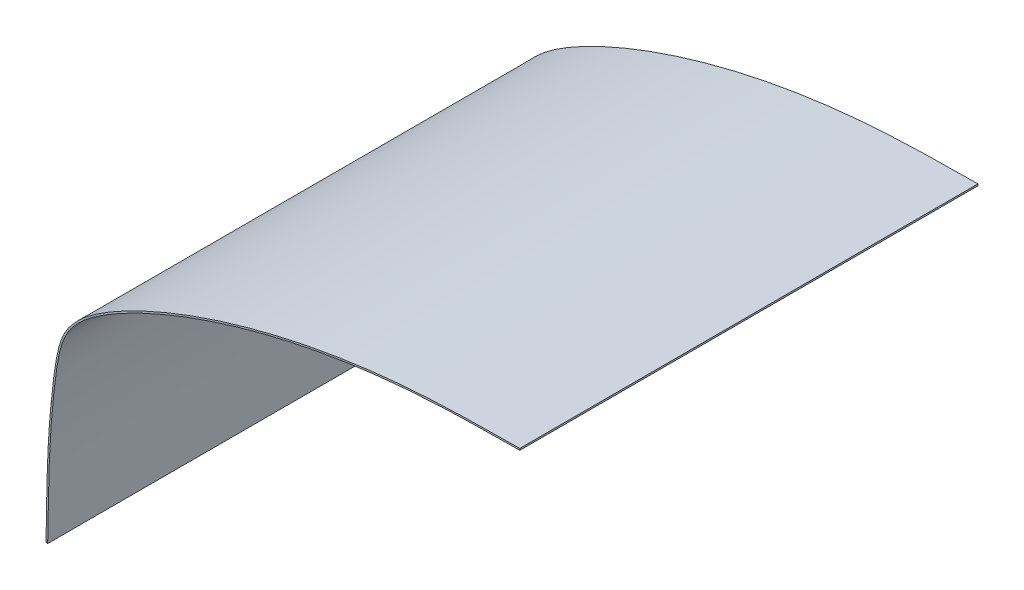
ISO-10303-21;
HEADER;
FILE_DESCRIPTION(('STEP AP214'),'2;1');
FILE_NAME('part.step','',(''),(''),'','','');
FILE_SCHEMA(('AUTOMOTIVE_DESIGN { 1 0 10303 214 1 1 1 1 }'));
ENDSEC;
DATA;
#1=APPLICATION_CONTEXT('core data for automotive mechanical design processes');
#2=APPLICATION_PROTOCOL_DEFINITION('international standard','automotive_design',2000,#1);
#3=PRODUCT_CONTEXT('',#1,'mechanical');
#4=PRODUCT('Part','Part','',(#3));
#5=PRODUCT_RELATED_PRODUCT_CATEGORY('part','',(#4));
#6=PRODUCT_DEFINITION_FORMATION('','',#4);
#7=PRODUCT_DEFINITION_CONTEXT('part definition',#1,'design');
#8=PRODUCT_DEFINITION('design','',#6,#7);
#9=PRODUCT_DEFINITION_SHAPE('','',#8);
#10=(LENGTH_UNIT() NAMED_UNIT(*) SI_UNIT(.MILLI.,.METRE.));
#11=(NAMED_UNIT(*) PLANE_ANGLE_UNIT() SI_UNIT($,.RADIAN.));
#12=(NAMED_UNIT(*) SI_UNIT($,.STERADIAN.) SOLID_ANGLE_UNIT());
#13=UNCERTAINTY_MEASURE_WITH_UNIT(LENGTH_MEASURE(1.E-05),#10,'distance_accuracy_value','');
#14=(GEOMETRIC_REPRESENTATION_CONTEXT(3) GLOBAL_UNCERTAINTY_ASSIGNED_CONTEXT((#13)) GLOBAL_UNIT_ASSIGNED_CONTEXT((#10,
#11,#12)) REPRESENTATION_CONTEXT('',''));
#15=CARTESIAN_POINT('',(0.,0.,0.));
#16=DIRECTION('',(0.,0.,1.));
#17=DIRECTION('',(1.,0.,0.));
#18=AXIS2_PLACEMENT_3D('',#15,#16,#17);
#19=CARTESIAN_POINT('',(-954.562567684704,-367.060526194167,820.));
#20=CARTESIAN_POINT('',(-949.731580753523,-240.772303614039,820.));
#21=CARTESIAN_POINT('',(-965.897306625211,-60.6768027234358,820.));
#22=CARTESIAN_POINT('',(-899.861496721399,-44.1678502474826,820.));
#23=CARTESIAN_POINT('',(-938.084782602638,-2.00052486851282,820.));
#24=CARTESIAN_POINT('',(-973.67710425698,-35.9596243008455,820.));
#25=CARTESIAN_POINT('',(-868.494487017088,61.4894455986176,820.));
#26=CARTESIAN_POINT('',(-756.654782625281,120.575073505418,820.));
#27=CARTESIAN_POINT('',(-600.913737595076,149.988916038669,820.));
#28=CARTESIAN_POINT('',(-454.833796863585,205.450958104821,820.));
#29=CARTESIAN_POINT('',(-262.325865110254,197.223411300237,820.));
#30=CARTESIAN_POINT('',(-109.562567684704,199.939473805833,820.));
#31=B_SPLINE_CURVE_WITH_KNOTS('',11,(#19,#20,#21,#22,#23,#24,#25,#26,#27,#28,#29,#30),
.UNSPECIFIED.,.F.,.F.,(12,12),(0.,1.),.UNSPECIFIED.);
#32=DIRECTION('',(0.,0.,-1.));
#33=VECTOR('',#32,1.);
#34=SURFACE_OF_LINEAR_EXTRUSION('',#31,#33);
#35=CARTESIAN_POINT('',(-954.562567684704,-367.060526194167,0.));
#36=CARTESIAN_POINT('',(-949.731580753523,-240.772303614039,0.));
#37=CARTESIAN_POINT('',(-965.897306625211,-60.6768027234358,0.));
#38=CARTESIAN_POINT('',(-899.861496721399,-44.1678502474826,0.));
#39=CARTESIAN_POINT('',(-938.084782602638,-2.00052486851282,0.));
#40=CARTESIAN_POINT('',(-973.67710425698,-35.9596243008455,0.));
#41=CARTESIAN_POINT('',(-868.494487017088,61.4894455986176,0.));
#42=CARTESIAN_POINT('',(-756.654782625281,120.575073505418,0.));
#43=CARTESIAN_POINT('',(-600.913737595076,149.988916038669,0.));
#44=CARTESIAN_POINT('',(-454.833796863585,205.450958104821,0.));
#45=CARTESIAN_POINT('',(-262.325865110254,197.223411300237,0.));
#46=CARTESIAN_POINT('',(-109.562567684704,199.939473805833,0.));
#47=B_SPLINE_CURVE_WITH_KNOTS('',11,(#35,#36,#37,#38,#39,#40,#41,#42,#43,#44,#45,#46),
.UNSPECIFIED.,.F.,.F.,(12,12),(0.,1.),.UNSPECIFIED.);
#48=CARTESIAN_POINT('',(-954.562567684704,-367.060526194167,0.));
#49=VERTEX_POINT('',#48);
#50=CARTESIAN_POINT('',(-109.562567684704,199.939473805833,0.));
#51=VERTEX_POINT('',#50);
#52=EDGE_CURVE('E115',#49,#51,#47,.T.);
#53=ORIENTED_EDGE('',*,*,#52,.T.);
#54=DIRECTION('',(0.,0.,-1.));
#55=VECTOR('',#54,1.);
#56=CARTESIAN_POINT('',(-109.562567684704,199.939473805833,820.));
#57=LINE('',#56,#55);
#58=CARTESIAN_POINT('',(-109.562567684704,199.939473805833,820.));
#59=VERTEX_POINT('',#58);
#60=EDGE_CURVE('E11',#59,#51,#57,.T.);
#61=ORIENTED_EDGE('',*,*,#60,.F.);
#62=CARTESIAN_POINT('',(-954.562567684704,-367.060526194167,820.));
#63=VERTEX_POINT('',#62);
#64=EDGE_CURVE('E84',#63,#59,#31,.T.);
#65=ORIENTED_EDGE('',*,*,#64,.F.);
#66=DIRECTION('',(0.,0.,-1.));
#67=VECTOR('',#66,1.);
#68=CARTESIAN_POINT('',(-954.562567684704,-367.060526194167,820.));
#69=LINE('',#68,#67);
#70=EDGE_CURVE('E92',#63,#49,#69,.T.);
#71=ORIENTED_EDGE('',*,*,#70,.T.);
#72=EDGE_LOOP('',(#53,#61,#65,#71));
#73=FACE_BOUND('',#72,.T.);
#74=ADVANCED_FACE('F32',(#73),#34,.F.);
#75=CARTESIAN_POINT('',(-109.615897902682,202.938999749687,820.));
#76=DIRECTION('',(-0.999841981284514,-0.0177767393258245,0.));
#77=DIRECTION('',(0.0177767393258245,-0.999841981284514,0.));
#78=AXIS2_PLACEMENT_3D('',#75,#76,#77);
#79=PLANE('',#78);
#80=DIRECTION('',(-0.0177767393258245,0.999841981284514,0.));
#81=VECTOR('',#80,1.);
#82=CARTESIAN_POINT('',(-109.615897902682,202.938999749687,0.));
#83=LINE('',#82,#81);
#84=CARTESIAN_POINT('',(-109.615897902682,202.938999749687,0.));
#85=VERTEX_POINT('',#84);
#86=EDGE_CURVE('E88',#51,#85,#83,.T.);
#87=ORIENTED_EDGE('',*,*,#86,.T.);
#88=DIRECTION('',(0.,0.,-1.));
#89=VECTOR('',#88,1.);
#90=CARTESIAN_POINT('',(-109.615897902682,202.938999749687,820.));
#91=LINE('',#90,#89);
#92=CARTESIAN_POINT('',(-109.615897902682,202.938999749687,820.));
#93=VERTEX_POINT('',#92);
#94=EDGE_CURVE('E41',#93,#85,#91,.T.);
#95=ORIENTED_EDGE('',*,*,#94,.F.);
#96=DIRECTION('',(-0.0177767393258245,0.999841981284514,0.));
#97=VECTOR('',#96,1.);
#98=CARTESIAN_POINT('',(-109.615897902682,202.938999749687,820.));
#99=LINE('',#98,#97);
#100=EDGE_CURVE('E79',#59,#93,#99,.T.);
#101=ORIENTED_EDGE('',*,*,#100,.F.);
#102=ORIENTED_EDGE('',*,*,#60,.T.);
#103=EDGE_LOOP('',(#87,#95,#101,#102));
#104=FACE_BOUND('',#103,.T.);
#105=ADVANCED_FACE('F87',(#104),#79,.F.);
#106=CARTESIAN_POINT('',(-109.615897902682,202.938999749687,820.));
#107=CARTESIAN_POINT('',(-111.812084174943,202.899952548625,820.));
#108=CARTESIAN_POINT('',(-116.188943028044,202.828633084042,820.));
#109=CARTESIAN_POINT('',(-125.068004862562,202.704017672114,820.));
#110=CARTESIAN_POINT('',(-136.300032766462,202.573622844877,820.));
#111=CARTESIAN_POINT('',(-149.983395326977,202.428656818115,820.));
#112=CARTESIAN_POINT('',(-168.44821632421,202.218428902712,820.));
#113=CARTESIAN_POINT('',(-191.872765559784,201.869587028044,820.));
#114=CARTESIAN_POINT('',(-220.33141625744,201.180234583126,820.));
#115=CARTESIAN_POINT('',(-248.980197439974,200.128228815906,820.));
#116=CARTESIAN_POINT('',(-287.260841305271,198.161346352815,820.));
#117=CARTESIAN_POINT('',(-334.995023474982,194.543215494899,820.));
#118=CARTESIAN_POINT('',(-391.456804285099,188.239546684976,820.));
#119=CARTESIAN_POINT('',(-446.655979823249,180.035170307815,820.));
#120=CARTESIAN_POINT('',(-500.236812697131,170.068310034005,820.));
#121=CARTESIAN_POINT('',(-569.092782722865,154.676600679488,820.));
#122=CARTESIAN_POINT('',(-649.530922386277,132.016568468639,820.));
#123=CARTESIAN_POINT('',(-734.370725779049,101.379408234549,820.));
#124=CARTESIAN_POINT('',(-793.097994201342,74.9636778770418,820.));
#125=CARTESIAN_POINT('',(-831.983793005192,54.3826663530112,820.));
#126=CARTESIAN_POINT('',(-857.036453991402,39.3998808070255,820.));
#127=CARTESIAN_POINT('',(-878.016770029999,24.9663824681657,820.));
#128=CARTESIAN_POINT('',(-900.816757652369,6.40639368865939,820.));
#129=CARTESIAN_POINT('',(-920.377055336985,-15.8892990658651,820.));
#130=CARTESIAN_POINT('',(-931.10728263274,-39.3149052458166,820.));
#131=CARTESIAN_POINT('',(-936.846124618058,-60.979870695408,820.));
#132=CARTESIAN_POINT('',(-940.335202165335,-79.4809498639309,820.));
#133=CARTESIAN_POINT('',(-943.466913183045,-101.057608761825,820.));
#134=CARTESIAN_POINT('',(-946.507035512906,-126.504911554263,820.));
#135=CARTESIAN_POINT('',(-949.497156890397,-156.475685374864,820.));
#136=CARTESIAN_POINT('',(-952.268964614096,-191.36177861243,820.));
#137=CARTESIAN_POINT('',(-954.137950859806,-224.517938949203,820.));
#138=CARTESIAN_POINT('',(-955.233841128985,-253.146338169904,820.));
#139=CARTESIAN_POINT('',(-955.849188355118,-275.487721683028,820.));
#140=CARTESIAN_POINT('',(-956.279114550586,-298.4571368903,820.));
#141=CARTESIAN_POINT('',(-956.538788633837,-317.842823936978,820.));
#142=CARTESIAN_POINT('',(-956.754044854249,-333.271807936252,820.));
#143=CARTESIAN_POINT('',(-956.944420521896,-344.735944734625,820.));
#144=CARTESIAN_POINT('',(-957.151551731979,-354.126817351651,820.));
#145=CARTESIAN_POINT('',(-957.365491157237,-361.515931370859,820.));
#146=CARTESIAN_POINT('',(-957.490886783216,-365.129335560339,820.));
#147=CARTESIAN_POINT('',(-957.560375076874,-366.945849084632,820.));
#148=B_SPLINE_CURVE_WITH_KNOTS('',3,(#106,#107,#108,#109,#110,#111,#112,#113,#114,#115,#116,
#117,#118,#119,#120,#121,#122,#123,#124,#125,#126,#127,#128,#129,#130,#131,#132,#133,#134,#135,
#136,#137,#138,#139,#140,#141,#142,#143,#144,#145,#146,#147),.UNSPECIFIED.,.F.,.F.,(4,1,1,1,1,1,
1,1,1,1,1,1,1,1,1,1,1,1,1,1,1,1,1,1,1,1,1,1,1,1,1,1,1,1,1,1,1,1,1,4),(0.,0.00390625,0.0078125,
0.015625,0.0234375,0.03125,0.046875,0.0625,0.078125,0.09375,0.125,0.15625,0.1875,0.21875,0.25,
0.3125,0.375,0.4375,0.46875,0.5,0.53125,0.5625,0.625,0.6875,0.71875,0.75,0.78125,0.8125,0.84375,
0.875,0.90625,0.921875,0.9375,0.953125,0.96875,0.9765625,0.984375,0.9921875,0.99609375,1.),.UNSPECIFIED.);
#149=DIRECTION('',(0.,0.,-1.));
#150=VECTOR('',#149,1.);
#151=SURFACE_OF_LINEAR_EXTRUSION('',#148,#150);
#152=CARTESIAN_POINT('',(-109.615897902682,202.938999749687,0.));
#153=CARTESIAN_POINT('',(-111.812084174943,202.899952548625,0.));
#154=CARTESIAN_POINT('',(-116.188943028044,202.828633084042,0.));
#155=CARTESIAN_POINT('',(-125.068004862562,202.704017672114,0.));
#156=CARTESIAN_POINT('',(-136.300032766462,202.573622844877,0.));
#157=CARTESIAN_POINT('',(-149.983395326977,202.428656818115,0.));
#158=CARTESIAN_POINT('',(-168.44821632421,202.218428902712,0.));
#159=CARTESIAN_POINT('',(-191.872765559784,201.869587028044,0.));
#160=CARTESIAN_POINT('',(-220.33141625744,201.180234583126,0.));
#161=CARTESIAN_POINT('',(-248.980197439974,200.128228815906,0.));
#162=CARTESIAN_POINT('',(-287.260841305271,198.161346352815,0.));
#163=CARTESIAN_POINT('',(-334.995023474982,194.543215494899,0.));
#164=CARTESIAN_POINT('',(-391.456804285099,188.239546684976,0.));
#165=CARTESIAN_POINT('',(-446.655979823249,180.035170307815,0.));
#166=CARTESIAN_POINT('',(-500.236812697131,170.068310034005,0.));
#167=CARTESIAN_POINT('',(-569.092782722865,154.676600679488,0.));
#168=CARTESIAN_POINT('',(-649.530922386277,132.016568468639,0.));
#169=CARTESIAN_POINT('',(-734.370725779049,101.379408234549,0.));
#170=CARTESIAN_POINT('',(-793.097994201342,74.9636778770418,0.));
#171=CARTESIAN_POINT('',(-831.983793005192,54.3826663530112,0.));
#172=CARTESIAN_POINT('',(-857.036453991402,39.3998808070255,0.));
#173=CARTESIAN_POINT('',(-878.016770029999,24.9663824681657,0.));
#174=CARTESIAN_POINT('',(-900.816757652369,6.40639368865939,0.));
#175=CARTESIAN_POINT('',(-920.377055336985,-15.8892990658651,0.));
#176=CARTESIAN_POINT('',(-931.10728263274,-39.3149052458166,0.));
#177=CARTESIAN_POINT('',(-936.846124618058,-60.979870695408,0.));
#178=CARTESIAN_POINT('',(-940.335202165335,-79.4809498639309,0.));
#179=CARTESIAN_POINT('',(-943.466913183045,-101.057608761825,0.));
#180=CARTESIAN_POINT('',(-946.507035512906,-126.504911554263,0.));
#181=CARTESIAN_POINT('',(-949.497156890397,-156.475685374864,0.));
#182=CARTESIAN_POINT('',(-952.268964614096,-191.36177861243,0.));
#183=CARTESIAN_POINT('',(-954.137950859806,-224.517938949203,0.));
#184=CARTESIAN_POINT('',(-955.233841128985,-253.146338169904,0.));
#185=CARTESIAN_POINT('',(-955.849188355118,-275.487721683028,0.));
#186=CARTESIAN_POINT('',(-956.279114550586,-298.4571368903,0.));
#187=CARTESIAN_POINT('',(-956.538788633837,-317.842823936978,0.));
#188=CARTESIAN_POINT('',(-956.754044854249,-333.271807936252,0.));
#189=CARTESIAN_POINT('',(-956.944420521896,-344.735944734625,0.));
#190=CARTESIAN_POINT('',(-957.151551731979,-354.126817351651,0.));
#191=CARTESIAN_POINT('',(-957.365491157237,-361.515931370859,0.));
#192=CARTESIAN_POINT('',(-957.490886783216,-365.129335560339,0.));
#193=CARTESIAN_POINT('',(-957.560375076874,-366.945849084632,0.));
#194=B_SPLINE_CURVE_WITH_KNOTS('',3,(#152,#153,#154,#155,#156,#157,#158,#159,#160,#161,#162,
#163,#164,#165,#166,#167,#168,#169,#170,#171,#172,#173,#174,#175,#176,#177,#178,#179,#180,#181,
#182,#183,#184,#185,#186,#187,#188,#189,#190,#191,#192,#193),.UNSPECIFIED.,.F.,.F.,(4,1,1,1,1,1,
1,1,1,1,1,1,1,1,1,1,1,1,1,1,1,1,1,1,1,1,1,1,1,1,1,1,1,1,1,1,1,1,1,4),(0.,0.00390625,0.0078125,
0.015625,0.0234375,0.03125,0.046875,0.0625,0.078125,0.09375,0.125,0.15625,0.1875,0.21875,0.25,
0.3125,0.375,0.4375,0.46875,0.5,0.53125,0.5625,0.625,0.6875,0.71875,0.75,0.78125,0.8125,0.84375,
0.875,0.90625,0.921875,0.9375,0.953125,0.96875,0.9765625,0.984375,0.9921875,0.99609375,1.),.UNSPECIFIED.);
#195=CARTESIAN_POINT('',(-957.560375076874,-366.945849084632,0.));
#196=VERTEX_POINT('',#195);
#197=EDGE_CURVE('E66',#85,#196,#194,.T.);
#198=ORIENTED_EDGE('',*,*,#197,.T.);
#199=DIRECTION('',(0.,0.,-1.));
#200=VECTOR('',#199,1.);
#201=CARTESIAN_POINT('',(-957.560375076874,-366.945849084632,820.));
#202=LINE('',#201,#200);
#203=CARTESIAN_POINT('',(-957.560375076874,-366.945849084632,820.));
#204=VERTEX_POINT('',#203);
#205=EDGE_CURVE('E89',#204,#196,#202,.T.);
#206=ORIENTED_EDGE('',*,*,#205,.F.);
#207=EDGE_CURVE('E82',#93,#204,#148,.T.);
#208=ORIENTED_EDGE('',*,*,#207,.F.);
#209=ORIENTED_EDGE('',*,*,#94,.T.);
#210=EDGE_LOOP('',(#198,#206,#208,#209));
#211=FACE_BOUND('',#210,.T.);
#212=ADVANCED_FACE('F90',(#211),#151,.F.);
#213=CARTESIAN_POINT('',(-957.560375076874,-366.945849084632,820.));
#214=DIRECTION('',(0.0382257031782594,0.999269130723314,0.));
#215=DIRECTION('',(-0.999269130723314,0.0382257031782594,0.));
#216=AXIS2_PLACEMENT_3D('',#213,#214,#215);
#217=PLANE('',#216);
#218=DIRECTION('',(0.999269130723314,-0.0382257031782594,0.));
#219=VECTOR('',#218,1.);
#220=CARTESIAN_POINT('',(-957.560375076874,-366.945849084632,0.));
#221=LINE('',#220,#219);
#222=EDGE_CURVE('E72',#196,#49,#221,.T.);
#223=ORIENTED_EDGE('',*,*,#222,.T.);
#224=ORIENTED_EDGE('',*,*,#70,.F.);
#225=DIRECTION('',(0.999269130723314,-0.0382257031782594,0.));
#226=VECTOR('',#225,1.);
#227=CARTESIAN_POINT('',(-957.560375076874,-366.945849084632,820.));
#228=LINE('',#227,#226);
#229=EDGE_CURVE('E49',#204,#63,#228,.T.);
#230=ORIENTED_EDGE('',*,*,#229,.F.);
#231=ORIENTED_EDGE('',*,*,#205,.T.);
#232=EDGE_LOOP('',(#223,#224,#230,#231));
#233=FACE_BOUND('',#232,.T.);
#234=ADVANCED_FACE('F104',(#233),#217,.F.);
#235=CARTESIAN_POINT('',(-854.74229154678,36.9635127067535,820.));
#236=DIRECTION('',(0.,0.,-1.));
#237=DIRECTION('',(-1.,0.,0.));
#238=AXIS2_PLACEMENT_3D('',#235,#236,#237);
#239=PLANE('',#238);
#240=ORIENTED_EDGE('',*,*,#64,.T.);
#241=ORIENTED_EDGE('',*,*,#100,.T.);
#242=ORIENTED_EDGE('',*,*,#207,.T.);
#243=ORIENTED_EDGE('',*,*,#229,.T.);
#244=EDGE_LOOP('',(#240,#241,#242,#243));
#245=FACE_BOUND('',#244,.T.);
#246=ADVANCED_FACE('F80',(#245),#239,.F.);
#247=CARTESIAN_POINT('',(-854.74229154678,36.9635127067535,0.));
#248=DIRECTION('',(0.,0.,-1.));
#249=DIRECTION('',(-1.,0.,0.));
#250=AXIS2_PLACEMENT_3D('',#247,#248,#249);
#251=PLANE('',#250);
#252=ORIENTED_EDGE('',*,*,#52,.F.);
#253=ORIENTED_EDGE('',*,*,#222,.F.);
#254=ORIENTED_EDGE('',*,*,#197,.F.);
#255=ORIENTED_EDGE('',*,*,#86,.F.);
#256=EDGE_LOOP('',(#252,#253,#254,#255));
#257=FACE_BOUND('',#256,.T.);
#258=ADVANCED_FACE('F132',(#257),#251,.T.);
#259=CLOSED_SHELL('',(#74,#105,#212,#234,#246,#258));
#260=MANIFOLD_SOLID_BREP('B2',#259);
#261=ADVANCED_BREP_SHAPE_REPRESENTATION('',(#18,#260),#14);
#262=SHAPE_DEFINITION_REPRESENTATION(#9,#261);
ENDSEC;
END-ISO-10303-21;
